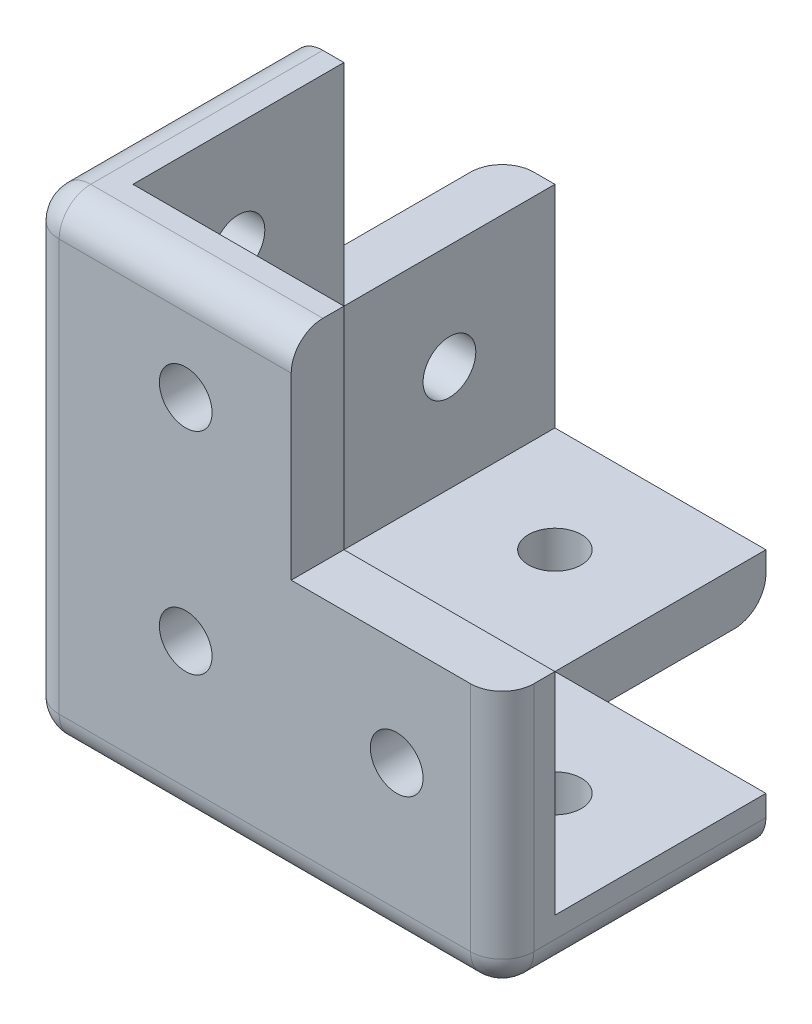
ISO-10303-21;
HEADER;
FILE_DESCRIPTION(('STEP AP214'),'2;1');
FILE_NAME('part.step','',(''),(''),'','','');
FILE_SCHEMA(('AUTOMOTIVE_DESIGN { 1 0 10303 214 1 1 1 1 }'));
ENDSEC;
DATA;
#1=APPLICATION_CONTEXT('core data for automotive mechanical design processes');
#2=APPLICATION_PROTOCOL_DEFINITION('international standard','automotive_design',2000,#1);
#3=PRODUCT_CONTEXT('',#1,'mechanical');
#4=PRODUCT('Part','Part','',(#3));
#5=PRODUCT_RELATED_PRODUCT_CATEGORY('part','',(#4));
#6=PRODUCT_DEFINITION_FORMATION('','',#4);
#7=PRODUCT_DEFINITION_CONTEXT('part definition',#1,'design');
#8=PRODUCT_DEFINITION('design','',#6,#7);
#9=PRODUCT_DEFINITION_SHAPE('','',#8);
#10=(LENGTH_UNIT() NAMED_UNIT(*) SI_UNIT(.MILLI.,.METRE.));
#11=(NAMED_UNIT(*) PLANE_ANGLE_UNIT() SI_UNIT($,.RADIAN.));
#12=(NAMED_UNIT(*) SI_UNIT($,.STERADIAN.) SOLID_ANGLE_UNIT());
#13=UNCERTAINTY_MEASURE_WITH_UNIT(LENGTH_MEASURE(1.E-05),#10,'distance_accuracy_value','');
#14=(GEOMETRIC_REPRESENTATION_CONTEXT(3) GLOBAL_UNCERTAINTY_ASSIGNED_CONTEXT((#13)) GLOBAL_UNIT_ASSIGNED_CONTEXT((#10,
#11,#12)) REPRESENTATION_CONTEXT('',''));
#15=CARTESIAN_POINT('',(0.,0.,0.));
#16=DIRECTION('',(0.,0.,1.));
#17=DIRECTION('',(1.,0.,0.));
#18=AXIS2_PLACEMENT_3D('',#15,#16,#17);
#19=CARTESIAN_POINT('',(20.,20.,0.));
#20=DIRECTION('',(1.,0.,0.));
#21=DIRECTION('',(0.,0.,-1.));
#22=AXIS2_PLACEMENT_3D('',#19,#20,#21);
#23=PLANE('',#22);
#24=DIRECTION('',(0.,0.,1.));
#25=VECTOR('',#24,1.);
#26=CARTESIAN_POINT('',(20.,-5.,0.));
#27=LINE('',#26,#25);
#28=CARTESIAN_POINT('',(20.,-5.,-37.));
#29=VERTEX_POINT('',#28);
#30=CARTESIAN_POINT('',(20.,-5.,-20.));
#31=VERTEX_POINT('',#30);
#32=EDGE_CURVE('E222',#29,#31,#27,.T.);
#33=ORIENTED_EDGE('',*,*,#32,.F.);
#34=CARTESIAN_POINT('',(20.,-2.,-37.));
#35=DIRECTION('',(1.,0.,0.));
#36=DIRECTION('',(0.,0.,-1.));
#37=AXIS2_PLACEMENT_3D('',#34,#35,#36);
#38=CIRCLE('',#37,3.);
#39=CARTESIAN_POINT('',(20.,-2.,-40.));
#40=VERTEX_POINT('',#39);
#41=EDGE_CURVE('E280',#29,#40,#38,.T.);
#42=ORIENTED_EDGE('',*,*,#41,.T.);
#43=DIRECTION('',(0.,-1.,0.));
#44=VECTOR('',#43,1.);
#45=CARTESIAN_POINT('',(20.,20.,-40.));
#46=LINE('',#45,#44);
#47=CARTESIAN_POINT('',(20.,0.,-40.));
#48=VERTEX_POINT('',#47);
#49=EDGE_CURVE('E236',#48,#40,#46,.T.);
#50=ORIENTED_EDGE('',*,*,#49,.F.);
#51=DIRECTION('',(0.,0.,-1.));
#52=VECTOR('',#51,1.);
#53=CARTESIAN_POINT('',(20.,0.,0.));
#54=LINE('',#53,#52);
#55=CARTESIAN_POINT('',(20.,0.,-20.));
#56=VERTEX_POINT('',#55);
#57=EDGE_CURVE('E188',#56,#48,#54,.T.);
#58=ORIENTED_EDGE('',*,*,#57,.F.);
#59=DIRECTION('',(0.,-1.,0.));
#60=VECTOR('',#59,1.);
#61=CARTESIAN_POINT('',(20.,20.,-20.));
#62=LINE('',#61,#60);
#63=EDGE_CURVE('E242',#56,#31,#62,.T.);
#64=ORIENTED_EDGE('',*,*,#63,.T.);
#65=EDGE_LOOP('',(#33,#42,#50,#58,#64));
#66=FACE_BOUND('',#65,.T.);
#67=ADVANCED_FACE('F34',(#66),#23,.T.);
#68=CARTESIAN_POINT('',(0.,20.,-20.));
#69=DIRECTION('',(0.,0.,1.));
#70=DIRECTION('',(1.,0.,0.));
#71=AXIS2_PLACEMENT_3D('',#68,#69,#70);
#72=PLANE('',#71);
#73=DIRECTION('',(0.,-1.,0.));
#74=VECTOR('',#73,1.);
#75=CARTESIAN_POINT('',(40.,20.,-20.));
#76=LINE('',#75,#74);
#77=CARTESIAN_POINT('',(40.,0.,-20.));
#78=VERTEX_POINT('',#77);
#79=CARTESIAN_POINT('',(40.,-2.,-20.));
#80=VERTEX_POINT('',#79);
#81=EDGE_CURVE('E247',#78,#80,#76,.T.);
#82=ORIENTED_EDGE('',*,*,#81,.T.);
#83=CARTESIAN_POINT('',(37.,-2.,-20.));
#84=DIRECTION('',(0.,0.,1.));
#85=DIRECTION('',(1.,0.,0.));
#86=AXIS2_PLACEMENT_3D('',#83,#84,#85);
#87=CIRCLE('',#86,3.);
#88=CARTESIAN_POINT('',(37.,-5.,-20.));
#89=VERTEX_POINT('',#88);
#90=EDGE_CURVE('E286',#80,#89,#87,.F.);
#91=ORIENTED_EDGE('',*,*,#90,.T.);
#92=DIRECTION('',(1.,0.,0.));
#93=VECTOR('',#92,1.);
#94=CARTESIAN_POINT('',(0.,-5.,-20.));
#95=LINE('',#94,#93);
#96=EDGE_CURVE('E224',#31,#89,#95,.T.);
#97=ORIENTED_EDGE('',*,*,#96,.F.);
#98=ORIENTED_EDGE('',*,*,#63,.F.);
#99=DIRECTION('',(-1.,0.,0.));
#100=VECTOR('',#99,1.);
#101=CARTESIAN_POINT('',(0.,0.,-20.));
#102=LINE('',#101,#100);
#103=EDGE_CURVE('E201',#78,#56,#102,.T.);
#104=ORIENTED_EDGE('',*,*,#103,.F.);
#105=EDGE_LOOP('',(#82,#91,#97,#98,#104));
#106=FACE_BOUND('',#105,.T.);
#107=ADVANCED_FACE('F413',(#106),#72,.F.);
#108=DIRECTION('',(0.,0.,1.));
#109=VECTOR('',#108,1.);
#110=CARTESIAN_POINT('',(20.,40.,0.));
#111=LINE('',#110,#109);
#112=CARTESIAN_POINT('',(20.,40.,0.));
#113=VERTEX_POINT('',#112);
#114=CARTESIAN_POINT('',(20.,40.,2.));
#115=VERTEX_POINT('',#114);
#116=EDGE_CURVE('E246',#113,#115,#111,.T.);
#117=ORIENTED_EDGE('',*,*,#116,.T.);
#118=CARTESIAN_POINT('',(20.,37.,2.));
#119=DIRECTION('',(1.,0.,0.));
#120=DIRECTION('',(0.,0.,-1.));
#121=AXIS2_PLACEMENT_3D('',#118,#119,#120);
#122=CIRCLE('',#121,3.);
#123=CARTESIAN_POINT('',(20.,37.,5.));
#124=VERTEX_POINT('',#123);
#125=EDGE_CURVE('E11',#115,#124,#122,.T.);
#126=ORIENTED_EDGE('',*,*,#125,.T.);
#127=DIRECTION('',(0.,1.,0.));
#128=VECTOR('',#127,1.);
#129=CARTESIAN_POINT('',(20.,20.,5.));
#130=LINE('',#129,#128);
#131=CARTESIAN_POINT('',(20.,20.,5.));
#132=VERTEX_POINT('',#131);
#133=EDGE_CURVE('E219',#132,#124,#130,.T.);
#134=ORIENTED_EDGE('',*,*,#133,.F.);
#135=DIRECTION('',(0.,0.,1.));
#136=VECTOR('',#135,1.);
#137=CARTESIAN_POINT('',(20.,20.,0.));
#138=LINE('',#137,#136);
#139=CARTESIAN_POINT('',(20.,20.,0.));
#140=VERTEX_POINT('',#139);
#141=EDGE_CURVE('E227',#140,#132,#138,.T.);
#142=ORIENTED_EDGE('',*,*,#141,.F.);
#143=DIRECTION('',(0.,-1.,0.));
#144=VECTOR('',#143,1.);
#145=CARTESIAN_POINT('',(20.,20.,0.));
#146=LINE('',#145,#144);
#147=EDGE_CURVE('E205',#113,#140,#146,.T.);
#148=ORIENTED_EDGE('',*,*,#147,.F.);
#149=EDGE_LOOP('',(#117,#126,#134,#142,#148));
#150=FACE_BOUND('',#149,.T.);
#151=ADVANCED_FACE('F502',(#150),#23,.T.);
#152=CARTESIAN_POINT('',(0.,20.,-40.));
#153=DIRECTION('',(0.,0.,-1.));
#154=DIRECTION('',(-1.,0.,0.));
#155=AXIS2_PLACEMENT_3D('',#152,#153,#154);
#156=PLANE('',#155);
#157=DIRECTION('',(1.,0.,0.));
#158=VECTOR('',#157,1.);
#159=CARTESIAN_POINT('',(0.,-2.,-40.));
#160=LINE('',#159,#158);
#161=CARTESIAN_POINT('',(-2.,-2.,-40.));
#162=VERTEX_POINT('',#161);
#163=EDGE_CURVE('E258',#40,#162,#160,.F.);
#164=ORIENTED_EDGE('',*,*,#163,.T.);
#165=DIRECTION('',(0.,1.,0.));
#166=VECTOR('',#165,1.);
#167=CARTESIAN_POINT('',(-2.,20.,-40.));
#168=LINE('',#167,#166);
#169=CARTESIAN_POINT('',(-2.,20.,-40.));
#170=VERTEX_POINT('',#169);
#171=EDGE_CURVE('E260',#162,#170,#168,.T.);
#172=ORIENTED_EDGE('',*,*,#171,.T.);
#173=DIRECTION('',(1.,0.,0.));
#174=VECTOR('',#173,1.);
#175=CARTESIAN_POINT('',(0.,20.,-40.));
#176=LINE('',#175,#174);
#177=CARTESIAN_POINT('',(0.,20.,-40.));
#178=VERTEX_POINT('',#177);
#179=EDGE_CURVE('E197',#170,#178,#176,.T.);
#180=ORIENTED_EDGE('',*,*,#179,.T.);
#181=DIRECTION('',(0.,1.,0.));
#182=VECTOR('',#181,1.);
#183=CARTESIAN_POINT('',(0.,0.,-40.));
#184=LINE('',#183,#182);
#185=CARTESIAN_POINT('',(0.,0.,-40.));
#186=VERTEX_POINT('',#185);
#187=EDGE_CURVE('E175',#186,#178,#184,.T.);
#188=ORIENTED_EDGE('',*,*,#187,.F.);
#189=DIRECTION('',(-1.,0.,0.));
#190=VECTOR('',#189,1.);
#191=CARTESIAN_POINT('',(0.,0.,-40.));
#192=LINE('',#191,#190);
#193=EDGE_CURVE('E183',#48,#186,#192,.T.);
#194=ORIENTED_EDGE('',*,*,#193,.F.);
#195=ORIENTED_EDGE('',*,*,#49,.T.);
#196=EDGE_LOOP('',(#164,#172,#180,#188,#194,#195));
#197=FACE_BOUND('',#196,.T.);
#198=ADVANCED_FACE('F194',(#197),#156,.T.);
#199=CARTESIAN_POINT('',(0.,20.,0.));
#200=DIRECTION('',(0.,1.,0.));
#201=DIRECTION('',(0.,0.,1.));
#202=AXIS2_PLACEMENT_3D('',#199,#200,#201);
#203=PLANE('',#202);
#204=ORIENTED_EDGE('',*,*,#179,.F.);
#205=CARTESIAN_POINT('',(-2.,20.,-37.));
#206=DIRECTION('',(0.,1.,0.));
#207=DIRECTION('',(0.,0.,1.));
#208=AXIS2_PLACEMENT_3D('',#205,#206,#207);
#209=CIRCLE('',#208,3.);
#210=CARTESIAN_POINT('',(-5.,20.,-37.));
#211=VERTEX_POINT('',#210);
#212=EDGE_CURVE('E262',#170,#211,#209,.T.);
#213=ORIENTED_EDGE('',*,*,#212,.T.);
#214=DIRECTION('',(0.,0.,-1.));
#215=VECTOR('',#214,1.);
#216=CARTESIAN_POINT('',(-5.,20.,0.));
#217=LINE('',#216,#215);
#218=CARTESIAN_POINT('',(-5.,20.,-20.));
#219=VERTEX_POINT('',#218);
#220=EDGE_CURVE('E212',#219,#211,#217,.T.);
#221=ORIENTED_EDGE('',*,*,#220,.F.);
#222=DIRECTION('',(-1.,0.,0.));
#223=VECTOR('',#222,1.);
#224=CARTESIAN_POINT('',(0.,20.,-20.));
#225=LINE('',#224,#223);
#226=CARTESIAN_POINT('',(0.,20.,-20.));
#227=VERTEX_POINT('',#226);
#228=EDGE_CURVE('E254',#227,#219,#225,.T.);
#229=ORIENTED_EDGE('',*,*,#228,.F.);
#230=DIRECTION('',(0.,0.,1.));
#231=VECTOR('',#230,1.);
#232=CARTESIAN_POINT('',(0.,20.,0.));
#233=LINE('',#232,#231);
#234=EDGE_CURVE('E210',#178,#227,#233,.T.);
#235=ORIENTED_EDGE('',*,*,#234,.F.);
#236=EDGE_LOOP('',(#204,#213,#221,#229,#235));
#237=FACE_BOUND('',#236,.T.);
#238=ADVANCED_FACE('F450',(#237),#203,.T.);
#239=CARTESIAN_POINT('',(0.,40.,-20.));
#240=DIRECTION('',(0.,0.,1.));
#241=DIRECTION('',(1.,0.,0.));
#242=AXIS2_PLACEMENT_3D('',#239,#240,#241);
#243=PLANE('',#242);
#244=DIRECTION('',(0.,-1.,0.));
#245=VECTOR('',#244,1.);
#246=CARTESIAN_POINT('',(-5.,0.,-20.));
#247=LINE('',#246,#245);
#248=CARTESIAN_POINT('',(-5.,37.,-20.));
#249=VERTEX_POINT('',#248);
#250=EDGE_CURVE('E215',#249,#219,#247,.T.);
#251=ORIENTED_EDGE('',*,*,#250,.F.);
#252=CARTESIAN_POINT('',(-2.,37.,-20.));
#253=DIRECTION('',(0.,0.,1.));
#254=DIRECTION('',(1.,0.,0.));
#255=AXIS2_PLACEMENT_3D('',#252,#253,#254);
#256=CIRCLE('',#255,3.);
#257=CARTESIAN_POINT('',(-2.,40.,-20.));
#258=VERTEX_POINT('',#257);
#259=EDGE_CURVE('E298',#249,#258,#256,.F.);
#260=ORIENTED_EDGE('',*,*,#259,.T.);
#261=DIRECTION('',(-1.,0.,0.));
#262=VECTOR('',#261,1.);
#263=CARTESIAN_POINT('',(0.,40.,-20.));
#264=LINE('',#263,#262);
#265=CARTESIAN_POINT('',(0.,40.,-20.));
#266=VERTEX_POINT('',#265);
#267=EDGE_CURVE('E252',#266,#258,#264,.T.);
#268=ORIENTED_EDGE('',*,*,#267,.F.);
#269=DIRECTION('',(0.,-1.,0.));
#270=VECTOR('',#269,1.);
#271=CARTESIAN_POINT('',(0.,40.,-20.));
#272=LINE('',#271,#270);
#273=EDGE_CURVE('E207',#266,#227,#272,.T.);
#274=ORIENTED_EDGE('',*,*,#273,.T.);
#275=ORIENTED_EDGE('',*,*,#228,.T.);
#276=EDGE_LOOP('',(#251,#260,#268,#274,#275));
#277=FACE_BOUND('',#276,.T.);
#278=ADVANCED_FACE('F457',(#277),#243,.F.);
#279=CARTESIAN_POINT('',(0.,40.,0.));
#280=DIRECTION('',(0.,1.,0.));
#281=DIRECTION('',(0.,0.,1.));
#282=AXIS2_PLACEMENT_3D('',#279,#280,#281);
#283=PLANE('',#282);
#284=ORIENTED_EDGE('',*,*,#267,.T.);
#285=DIRECTION('',(0.,0.,-1.));
#286=VECTOR('',#285,1.);
#287=CARTESIAN_POINT('',(-2.,40.,5.));
#288=LINE('',#287,#286);
#289=CARTESIAN_POINT('',(-2.,40.,2.));
#290=VERTEX_POINT('',#289);
#291=EDGE_CURVE('E43',#258,#290,#288,.F.);
#292=ORIENTED_EDGE('',*,*,#291,.T.);
#293=DIRECTION('',(-1.,0.,0.));
#294=VECTOR('',#293,1.);
#295=CARTESIAN_POINT('',(20.,40.,2.));
#296=LINE('',#295,#294);
#297=EDGE_CURVE('E54',#290,#115,#296,.F.);
#298=ORIENTED_EDGE('',*,*,#297,.T.);
#299=ORIENTED_EDGE('',*,*,#116,.F.);
#300=DIRECTION('',(1.,0.,0.));
#301=VECTOR('',#300,1.);
#302=CARTESIAN_POINT('',(0.,40.,0.));
#303=LINE('',#302,#301);
#304=CARTESIAN_POINT('',(0.,40.,0.));
#305=VERTEX_POINT('',#304);
#306=EDGE_CURVE('E192',#305,#113,#303,.T.);
#307=ORIENTED_EDGE('',*,*,#306,.F.);
#308=DIRECTION('',(0.,0.,1.));
#309=VECTOR('',#308,1.);
#310=CARTESIAN_POINT('',(0.,40.,0.));
#311=LINE('',#310,#309);
#312=EDGE_CURVE('E241',#266,#305,#311,.T.);
#313=ORIENTED_EDGE('',*,*,#312,.F.);
#314=EDGE_LOOP('',(#284,#292,#298,#299,#307,#313));
#315=FACE_BOUND('',#314,.T.);
#316=ADVANCED_FACE('F459',(#315),#283,.T.);
#317=CARTESIAN_POINT('',(40.,20.,0.));
#318=DIRECTION('',(-1.,0.,0.));
#319=DIRECTION('',(0.,0.,1.));
#320=AXIS2_PLACEMENT_3D('',#317,#318,#319);
#321=PLANE('',#320);
#322=DIRECTION('',(0.,1.,0.));
#323=VECTOR('',#322,1.);
#324=CARTESIAN_POINT('',(40.,20.,2.));
#325=LINE('',#324,#323);
#326=CARTESIAN_POINT('',(40.,20.,2.));
#327=VERTEX_POINT('',#326);
#328=CARTESIAN_POINT('',(40.,-2.,2.));
#329=VERTEX_POINT('',#328);
#330=EDGE_CURVE('E282',#327,#329,#325,.F.);
#331=ORIENTED_EDGE('',*,*,#330,.T.);
#332=DIRECTION('',(0.,0.,1.));
#333=VECTOR('',#332,1.);
#334=CARTESIAN_POINT('',(40.,-2.,-20.));
#335=LINE('',#334,#333);
#336=EDGE_CURVE('E284',#329,#80,#335,.F.);
#337=ORIENTED_EDGE('',*,*,#336,.T.);
#338=ORIENTED_EDGE('',*,*,#81,.F.);
#339=DIRECTION('',(0.,0.,-1.));
#340=VECTOR('',#339,1.);
#341=CARTESIAN_POINT('',(40.,0.,0.));
#342=LINE('',#341,#340);
#343=CARTESIAN_POINT('',(40.,0.,0.));
#344=VERTEX_POINT('',#343);
#345=EDGE_CURVE('E396',#344,#78,#342,.T.);
#346=ORIENTED_EDGE('',*,*,#345,.F.);
#347=DIRECTION('',(0.,1.,0.));
#348=VECTOR('',#347,1.);
#349=CARTESIAN_POINT('',(40.,0.,0.));
#350=LINE('',#349,#348);
#351=CARTESIAN_POINT('',(40.,20.,0.));
#352=VERTEX_POINT('',#351);
#353=EDGE_CURVE('E199',#344,#352,#350,.T.);
#354=ORIENTED_EDGE('',*,*,#353,.T.);
#355=DIRECTION('',(0.,0.,-1.));
#356=VECTOR('',#355,1.);
#357=CARTESIAN_POINT('',(40.,20.,0.));
#358=LINE('',#357,#356);
#359=EDGE_CURVE('E230',#327,#352,#358,.T.);
#360=ORIENTED_EDGE('',*,*,#359,.F.);
#361=EDGE_LOOP('',(#331,#337,#338,#346,#354,#360));
#362=FACE_BOUND('',#361,.T.);
#363=ADVANCED_FACE('F403',(#362),#321,.F.);
#364=CARTESIAN_POINT('',(0.,20.,0.));
#365=DIRECTION('',(0.,1.,0.));
#366=DIRECTION('',(0.,0.,1.));
#367=AXIS2_PLACEMENT_3D('',#364,#365,#366);
#368=PLANE('',#367);
#369=DIRECTION('',(-1.,0.,0.));
#370=VECTOR('',#369,1.);
#371=CARTESIAN_POINT('',(40.,20.,5.));
#372=LINE('',#371,#370);
#373=CARTESIAN_POINT('',(37.,20.,5.));
#374=VERTEX_POINT('',#373);
#375=EDGE_CURVE('E217',#374,#132,#372,.T.);
#376=ORIENTED_EDGE('',*,*,#375,.F.);
#377=CARTESIAN_POINT('',(37.,20.,2.));
#378=DIRECTION('',(0.,1.,0.));
#379=DIRECTION('',(0.,0.,1.));
#380=AXIS2_PLACEMENT_3D('',#377,#378,#379);
#381=CIRCLE('',#380,3.);
#382=EDGE_CURVE('E296',#374,#327,#381,.T.);
#383=ORIENTED_EDGE('',*,*,#382,.T.);
#384=ORIENTED_EDGE('',*,*,#359,.T.);
#385=DIRECTION('',(1.,0.,0.));
#386=VECTOR('',#385,1.);
#387=CARTESIAN_POINT('',(0.,20.,0.));
#388=LINE('',#387,#386);
#389=EDGE_CURVE('E238',#140,#352,#388,.T.);
#390=ORIENTED_EDGE('',*,*,#389,.F.);
#391=ORIENTED_EDGE('',*,*,#141,.T.);
#392=EDGE_LOOP('',(#376,#383,#384,#390,#391));
#393=FACE_BOUND('',#392,.T.);
#394=ADVANCED_FACE('F419',(#393),#368,.T.);
#395=CARTESIAN_POINT('',(-5.,-5.,0.));
#396=DIRECTION('',(1.,0.,0.));
#397=DIRECTION('',(0.,0.,-1.));
#398=AXIS2_PLACEMENT_3D('',#395,#396,#397);
#399=PLANE('',#398);
#400=CARTESIAN_POINT('',(-5.,10.,-10.));
#401=DIRECTION('',(1.,0.,0.));
#402=DIRECTION('',(0.,0.,-1.));
#403=AXIS2_PLACEMENT_3D('',#400,#401,#402);
#404=CIRCLE('',#403,2.5);
#405=CARTESIAN_POINT('',(-5.,10.,-12.5));
#406=VERTEX_POINT('',#405);
#407=EDGE_CURVE('E340',#406,#406,#404,.T.);
#408=ORIENTED_EDGE('',*,*,#407,.T.);
#409=EDGE_LOOP('',(#408));
#410=FACE_BOUND('',#409,.T.);
#411=CARTESIAN_POINT('',(-5.,10.,-30.));
#412=DIRECTION('',(1.,0.,0.));
#413=DIRECTION('',(0.,0.,-1.));
#414=AXIS2_PLACEMENT_3D('',#411,#412,#413);
#415=CIRCLE('',#414,2.5);
#416=CARTESIAN_POINT('',(-5.,10.,-32.5));
#417=VERTEX_POINT('',#416);
#418=EDGE_CURVE('E348',#417,#417,#415,.T.);
#419=ORIENTED_EDGE('',*,*,#418,.T.);
#420=EDGE_LOOP('',(#419));
#421=FACE_BOUND('',#420,.T.);
#422=CARTESIAN_POINT('',(-5.,30.,-10.));
#423=DIRECTION('',(1.,0.,0.));
#424=DIRECTION('',(0.,0.,-1.));
#425=AXIS2_PLACEMENT_3D('',#422,#423,#424);
#426=CIRCLE('',#425,2.5);
#427=CARTESIAN_POINT('',(-5.,30.,-12.5));
#428=VERTEX_POINT('',#427);
#429=EDGE_CURVE('E354',#428,#428,#426,.T.);
#430=ORIENTED_EDGE('',*,*,#429,.T.);
#431=EDGE_LOOP('',(#430));
#432=FACE_BOUND('',#431,.T.);
#433=ORIENTED_EDGE('',*,*,#220,.T.);
#434=DIRECTION('',(0.,1.,0.));
#435=VECTOR('',#434,1.);
#436=CARTESIAN_POINT('',(-5.,-5.,-37.));
#437=LINE('',#436,#435);
#438=CARTESIAN_POINT('',(-5.,-2.,-37.));
#439=VERTEX_POINT('',#438);
#440=EDGE_CURVE('E270',#211,#439,#437,.F.);
#441=ORIENTED_EDGE('',*,*,#440,.T.);
#442=DIRECTION('',(0.,0.,-1.));
#443=VECTOR('',#442,1.);
#444=CARTESIAN_POINT('',(-5.,-2.,5.));
#445=LINE('',#444,#443);
#446=CARTESIAN_POINT('',(-5.,-2.,2.));
#447=VERTEX_POINT('',#446);
#448=EDGE_CURVE('E268',#439,#447,#445,.F.);
#449=ORIENTED_EDGE('',*,*,#448,.T.);
#450=DIRECTION('',(0.,1.,0.));
#451=VECTOR('',#450,1.);
#452=CARTESIAN_POINT('',(-5.,-5.,2.));
#453=LINE('',#452,#451);
#454=CARTESIAN_POINT('',(-5.,37.,2.));
#455=VERTEX_POINT('',#454);
#456=EDGE_CURVE('E266',#447,#455,#453,.T.);
#457=ORIENTED_EDGE('',*,*,#456,.T.);
#458=DIRECTION('',(0.,0.,-1.));
#459=VECTOR('',#458,1.);
#460=CARTESIAN_POINT('',(-5.,37.,-20.));
#461=LINE('',#460,#459);
#462=EDGE_CURVE('E264',#455,#249,#461,.T.);
#463=ORIENTED_EDGE('',*,*,#462,.T.);
#464=ORIENTED_EDGE('',*,*,#250,.T.);
#465=EDGE_LOOP('',(#433,#441,#449,#457,#463,#464));
#466=FACE_BOUND('',#465,.T.);
#467=ADVANCED_FACE('F464',(#410,#421,#432,#466),#399,.F.);
#468=CARTESIAN_POINT('',(0.,-5.,5.));
#469=DIRECTION('',(0.,0.,-1.));
#470=DIRECTION('',(-1.,0.,0.));
#471=AXIS2_PLACEMENT_3D('',#468,#469,#470);
#472=PLANE('',#471);
#473=CARTESIAN_POINT('',(10.,10.,5.));
#474=DIRECTION('',(0.,0.,-1.));
#475=DIRECTION('',(-1.,0.,0.));
#476=AXIS2_PLACEMENT_3D('',#473,#474,#475);
#477=CIRCLE('',#476,2.5);
#478=CARTESIAN_POINT('',(7.5,10.,5.));
#479=VERTEX_POINT('',#478);
#480=EDGE_CURVE('E360',#479,#479,#477,.T.);
#481=ORIENTED_EDGE('',*,*,#480,.T.);
#482=EDGE_LOOP('',(#481));
#483=FACE_BOUND('',#482,.T.);
#484=CARTESIAN_POINT('',(30.,10.,5.));
#485=DIRECTION('',(0.,0.,-1.));
#486=DIRECTION('',(-1.,0.,0.));
#487=AXIS2_PLACEMENT_3D('',#484,#485,#486);
#488=CIRCLE('',#487,2.5);
#489=CARTESIAN_POINT('',(27.5,10.,5.));
#490=VERTEX_POINT('',#489);
#491=EDGE_CURVE('E366',#490,#490,#488,.T.);
#492=ORIENTED_EDGE('',*,*,#491,.T.);
#493=EDGE_LOOP('',(#492));
#494=FACE_BOUND('',#493,.T.);
#495=CARTESIAN_POINT('',(10.,30.,5.));
#496=DIRECTION('',(0.,0.,-1.));
#497=DIRECTION('',(-1.,0.,0.));
#498=AXIS2_PLACEMENT_3D('',#495,#496,#497);
#499=CIRCLE('',#498,2.5);
#500=CARTESIAN_POINT('',(7.5,30.,5.));
#501=VERTEX_POINT('',#500);
#502=EDGE_CURVE('E372',#501,#501,#499,.T.);
#503=ORIENTED_EDGE('',*,*,#502,.T.);
#504=EDGE_LOOP('',(#503));
#505=FACE_BOUND('',#504,.T.);
#506=DIRECTION('',(-1.,0.,0.));
#507=VECTOR('',#506,1.);
#508=CARTESIAN_POINT('',(40.,-2.,5.));
#509=LINE('',#508,#507);
#510=CARTESIAN_POINT('',(-2.,-2.,5.));
#511=VERTEX_POINT('',#510);
#512=CARTESIAN_POINT('',(37.,-2.,5.));
#513=VERTEX_POINT('',#512);
#514=EDGE_CURVE('E292',#511,#513,#509,.F.);
#515=ORIENTED_EDGE('',*,*,#514,.T.);
#516=DIRECTION('',(0.,1.,0.));
#517=VECTOR('',#516,1.);
#518=CARTESIAN_POINT('',(37.,-5.,5.));
#519=LINE('',#518,#517);
#520=EDGE_CURVE('E294',#513,#374,#519,.T.);
#521=ORIENTED_EDGE('',*,*,#520,.T.);
#522=ORIENTED_EDGE('',*,*,#375,.T.);
#523=ORIENTED_EDGE('',*,*,#133,.T.);
#524=DIRECTION('',(-1.,0.,0.));
#525=VECTOR('',#524,1.);
#526=CARTESIAN_POINT('',(-5.,37.,5.));
#527=LINE('',#526,#525);
#528=CARTESIAN_POINT('',(-2.,37.,5.));
#529=VERTEX_POINT('',#528);
#530=EDGE_CURVE('E288',#124,#529,#527,.T.);
#531=ORIENTED_EDGE('',*,*,#530,.T.);
#532=DIRECTION('',(0.,1.,0.));
#533=VECTOR('',#532,1.);
#534=CARTESIAN_POINT('',(-2.,-5.,5.));
#535=LINE('',#534,#533);
#536=EDGE_CURVE('E290',#529,#511,#535,.F.);
#537=ORIENTED_EDGE('',*,*,#536,.T.);
#538=EDGE_LOOP('',(#515,#521,#522,#523,#531,#537));
#539=FACE_BOUND('',#538,.T.);
#540=ADVANCED_FACE('F483',(#483,#494,#505,#539),#472,.F.);
#541=CARTESIAN_POINT('',(0.,-5.,0.));
#542=DIRECTION('',(0.,-1.,0.));
#543=DIRECTION('',(0.,0.,-1.));
#544=AXIS2_PLACEMENT_3D('',#541,#542,#543);
#545=PLANE('',#544);
#546=CARTESIAN_POINT('',(10.,-5.,-10.));
#547=DIRECTION('',(0.,1.,0.));
#548=DIRECTION('',(0.,0.,1.));
#549=AXIS2_PLACEMENT_3D('',#546,#547,#548);
#550=CIRCLE('',#549,2.5);
#551=CARTESIAN_POINT('',(10.,-5.,-7.5));
#552=VERTEX_POINT('',#551);
#553=EDGE_CURVE('E378',#552,#552,#550,.T.);
#554=ORIENTED_EDGE('',*,*,#553,.T.);
#555=EDGE_LOOP('',(#554));
#556=FACE_BOUND('',#555,.T.);
#557=CARTESIAN_POINT('',(30.,-5.,-10.));
#558=DIRECTION('',(0.,1.,0.));
#559=DIRECTION('',(0.,0.,1.));
#560=AXIS2_PLACEMENT_3D('',#557,#558,#559);
#561=CIRCLE('',#560,2.5);
#562=CARTESIAN_POINT('',(30.,-5.,-7.5));
#563=VERTEX_POINT('',#562);
#564=EDGE_CURVE('E384',#563,#563,#561,.T.);
#565=ORIENTED_EDGE('',*,*,#564,.T.);
#566=EDGE_LOOP('',(#565));
#567=FACE_BOUND('',#566,.T.);
#568=CARTESIAN_POINT('',(10.,-5.,-30.));
#569=DIRECTION('',(0.,1.,0.));
#570=DIRECTION('',(0.,0.,1.));
#571=AXIS2_PLACEMENT_3D('',#568,#569,#570);
#572=CIRCLE('',#571,2.5);
#573=CARTESIAN_POINT('',(10.,-5.,-27.5));
#574=VERTEX_POINT('',#573);
#575=EDGE_CURVE('E390',#574,#574,#572,.T.);
#576=ORIENTED_EDGE('',*,*,#575,.T.);
#577=EDGE_LOOP('',(#576));
#578=FACE_BOUND('',#577,.T.);
#579=DIRECTION('',(0.,0.,-1.));
#580=VECTOR('',#579,1.);
#581=CARTESIAN_POINT('',(-2.,-5.,-40.));
#582=LINE('',#581,#580);
#583=CARTESIAN_POINT('',(-2.,-5.,2.));
#584=VERTEX_POINT('',#583);
#585=CARTESIAN_POINT('',(-2.,-5.,-37.));
#586=VERTEX_POINT('',#585);
#587=EDGE_CURVE('E272',#584,#586,#582,.T.);
#588=ORIENTED_EDGE('',*,*,#587,.T.);
#589=DIRECTION('',(1.,0.,0.));
#590=VECTOR('',#589,1.);
#591=CARTESIAN_POINT('',(0.,-5.,-37.));
#592=LINE('',#591,#590);
#593=EDGE_CURVE('E278',#586,#29,#592,.T.);
#594=ORIENTED_EDGE('',*,*,#593,.T.);
#595=ORIENTED_EDGE('',*,*,#32,.T.);
#596=ORIENTED_EDGE('',*,*,#96,.T.);
#597=DIRECTION('',(0.,0.,1.));
#598=VECTOR('',#597,1.);
#599=CARTESIAN_POINT('',(37.,-5.,5.));
#600=LINE('',#599,#598);
#601=CARTESIAN_POINT('',(37.,-5.,2.));
#602=VERTEX_POINT('',#601);
#603=EDGE_CURVE('E276',#89,#602,#600,.T.);
#604=ORIENTED_EDGE('',*,*,#603,.T.);
#605=DIRECTION('',(-1.,0.,0.));
#606=VECTOR('',#605,1.);
#607=CARTESIAN_POINT('',(-5.,-5.,2.));
#608=LINE('',#607,#606);
#609=EDGE_CURVE('E274',#602,#584,#608,.T.);
#610=ORIENTED_EDGE('',*,*,#609,.T.);
#611=EDGE_LOOP('',(#588,#594,#595,#596,#604,#610));
#612=FACE_BOUND('',#611,.T.);
#613=ADVANCED_FACE('F432',(#556,#567,#578,#612),#545,.T.);
#614=CARTESIAN_POINT('',(0.,0.,0.));
#615=DIRECTION('',(0.,0.,1.));
#616=DIRECTION('',(1.,0.,0.));
#617=AXIS2_PLACEMENT_3D('',#614,#615,#616);
#618=PLANE('',#617);
#619=CARTESIAN_POINT('',(10.,10.,0.));
#620=DIRECTION('',(0.,0.,-1.));
#621=DIRECTION('',(-1.,0.,0.));
#622=AXIS2_PLACEMENT_3D('',#619,#620,#621);
#623=CIRCLE('',#622,2.5);
#624=CARTESIAN_POINT('',(7.5,10.,0.));
#625=VERTEX_POINT('',#624);
#626=EDGE_CURVE('E357',#625,#625,#623,.T.);
#627=ORIENTED_EDGE('',*,*,#626,.F.);
#628=EDGE_LOOP('',(#627));
#629=FACE_BOUND('',#628,.T.);
#630=CARTESIAN_POINT('',(30.,10.,0.));
#631=DIRECTION('',(0.,0.,-1.));
#632=DIRECTION('',(-1.,0.,0.));
#633=AXIS2_PLACEMENT_3D('',#630,#631,#632);
#634=CIRCLE('',#633,2.5);
#635=CARTESIAN_POINT('',(27.5,10.,0.));
#636=VERTEX_POINT('',#635);
#637=EDGE_CURVE('E363',#636,#636,#634,.T.);
#638=ORIENTED_EDGE('',*,*,#637,.F.);
#639=EDGE_LOOP('',(#638));
#640=FACE_BOUND('',#639,.T.);
#641=CARTESIAN_POINT('',(10.,30.,0.));
#642=DIRECTION('',(0.,0.,-1.));
#643=DIRECTION('',(-1.,0.,0.));
#644=AXIS2_PLACEMENT_3D('',#641,#642,#643);
#645=CIRCLE('',#644,2.5);
#646=CARTESIAN_POINT('',(7.5,30.,0.));
#647=VERTEX_POINT('',#646);
#648=EDGE_CURVE('E369',#647,#647,#645,.T.);
#649=ORIENTED_EDGE('',*,*,#648,.F.);
#650=EDGE_LOOP('',(#649));
#651=FACE_BOUND('',#650,.T.);
#652=ORIENTED_EDGE('',*,*,#147,.T.);
#653=ORIENTED_EDGE('',*,*,#389,.T.);
#654=ORIENTED_EDGE('',*,*,#353,.F.);
#655=DIRECTION('',(1.,0.,0.));
#656=VECTOR('',#655,1.);
#657=CARTESIAN_POINT('',(0.,0.,0.));
#658=LINE('',#657,#656);
#659=CARTESIAN_POINT('',(0.,0.,0.));
#660=VERTEX_POINT('',#659);
#661=EDGE_CURVE('E182',#660,#344,#658,.T.);
#662=ORIENTED_EDGE('',*,*,#661,.F.);
#663=DIRECTION('',(0.,1.,0.));
#664=VECTOR('',#663,1.);
#665=CARTESIAN_POINT('',(0.,0.,0.));
#666=LINE('',#665,#664);
#667=EDGE_CURVE('E178',#660,#305,#666,.T.);
#668=ORIENTED_EDGE('',*,*,#667,.T.);
#669=ORIENTED_EDGE('',*,*,#306,.T.);
#670=EDGE_LOOP('',(#652,#653,#654,#662,#668,#669));
#671=FACE_BOUND('',#670,.T.);
#672=ADVANCED_FACE('F407',(#629,#640,#651,#671),#618,.F.);
#673=CARTESIAN_POINT('',(0.,0.,0.));
#674=DIRECTION('',(-1.,0.,0.));
#675=DIRECTION('',(0.,0.,1.));
#676=AXIS2_PLACEMENT_3D('',#673,#674,#675);
#677=PLANE('',#676);
#678=CARTESIAN_POINT('',(0.,10.,-10.));
#679=DIRECTION('',(1.,0.,0.));
#680=DIRECTION('',(0.,0.,-1.));
#681=AXIS2_PLACEMENT_3D('',#678,#679,#680);
#682=CIRCLE('',#681,2.5);
#683=CARTESIAN_POINT('',(0.,10.,-12.5));
#684=VERTEX_POINT('',#683);
#685=EDGE_CURVE('E337',#684,#684,#682,.T.);
#686=ORIENTED_EDGE('',*,*,#685,.F.);
#687=EDGE_LOOP('',(#686));
#688=FACE_BOUND('',#687,.T.);
#689=CARTESIAN_POINT('',(0.,10.,-30.));
#690=DIRECTION('',(1.,0.,0.));
#691=DIRECTION('',(0.,0.,-1.));
#692=AXIS2_PLACEMENT_3D('',#689,#690,#691);
#693=CIRCLE('',#692,2.5);
#694=CARTESIAN_POINT('',(0.,10.,-32.5));
#695=VERTEX_POINT('',#694);
#696=EDGE_CURVE('E345',#695,#695,#693,.T.);
#697=ORIENTED_EDGE('',*,*,#696,.F.);
#698=EDGE_LOOP('',(#697));
#699=FACE_BOUND('',#698,.T.);
#700=CARTESIAN_POINT('',(0.,30.,-10.));
#701=DIRECTION('',(1.,0.,0.));
#702=DIRECTION('',(0.,0.,-1.));
#703=AXIS2_PLACEMENT_3D('',#700,#701,#702);
#704=CIRCLE('',#703,2.5);
#705=CARTESIAN_POINT('',(0.,30.,-12.5));
#706=VERTEX_POINT('',#705);
#707=EDGE_CURVE('E351',#706,#706,#704,.T.);
#708=ORIENTED_EDGE('',*,*,#707,.F.);
#709=EDGE_LOOP('',(#708));
#710=FACE_BOUND('',#709,.T.);
#711=ORIENTED_EDGE('',*,*,#234,.T.);
#712=ORIENTED_EDGE('',*,*,#273,.F.);
#713=ORIENTED_EDGE('',*,*,#312,.T.);
#714=ORIENTED_EDGE('',*,*,#667,.F.);
#715=DIRECTION('',(0.,0.,1.));
#716=VECTOR('',#715,1.);
#717=CARTESIAN_POINT('',(0.,0.,0.));
#718=LINE('',#717,#716);
#719=EDGE_CURVE('E171',#186,#660,#718,.T.);
#720=ORIENTED_EDGE('',*,*,#719,.F.);
#721=ORIENTED_EDGE('',*,*,#187,.T.);
#722=EDGE_LOOP('',(#711,#712,#713,#714,#720,#721));
#723=FACE_BOUND('',#722,.T.);
#724=ADVANCED_FACE('F173',(#688,#699,#710,#723),#677,.F.);
#725=CARTESIAN_POINT('',(0.,0.,0.));
#726=DIRECTION('',(0.,1.,0.));
#727=DIRECTION('',(0.,0.,1.));
#728=AXIS2_PLACEMENT_3D('',#725,#726,#727);
#729=PLANE('',#728);
#730=CARTESIAN_POINT('',(10.,0.,-10.));
#731=DIRECTION('',(0.,1.,0.));
#732=DIRECTION('',(0.,0.,1.));
#733=AXIS2_PLACEMENT_3D('',#730,#731,#732);
#734=CIRCLE('',#733,2.5);
#735=CARTESIAN_POINT('',(10.,0.,-7.5));
#736=VERTEX_POINT('',#735);
#737=EDGE_CURVE('E375',#736,#736,#734,.T.);
#738=ORIENTED_EDGE('',*,*,#737,.F.);
#739=EDGE_LOOP('',(#738));
#740=FACE_BOUND('',#739,.T.);
#741=CARTESIAN_POINT('',(30.,0.,-10.));
#742=DIRECTION('',(0.,1.,0.));
#743=DIRECTION('',(0.,0.,1.));
#744=AXIS2_PLACEMENT_3D('',#741,#742,#743);
#745=CIRCLE('',#744,2.5);
#746=CARTESIAN_POINT('',(30.,0.,-7.5));
#747=VERTEX_POINT('',#746);
#748=EDGE_CURVE('E381',#747,#747,#745,.T.);
#749=ORIENTED_EDGE('',*,*,#748,.F.);
#750=EDGE_LOOP('',(#749));
#751=FACE_BOUND('',#750,.T.);
#752=CARTESIAN_POINT('',(10.,0.,-30.));
#753=DIRECTION('',(0.,1.,0.));
#754=DIRECTION('',(0.,0.,1.));
#755=AXIS2_PLACEMENT_3D('',#752,#753,#754);
#756=CIRCLE('',#755,2.5);
#757=CARTESIAN_POINT('',(10.,0.,-27.5));
#758=VERTEX_POINT('',#757);
#759=EDGE_CURVE('E387',#758,#758,#756,.T.);
#760=ORIENTED_EDGE('',*,*,#759,.F.);
#761=EDGE_LOOP('',(#760));
#762=FACE_BOUND('',#761,.T.);
#763=ORIENTED_EDGE('',*,*,#193,.T.);
#764=ORIENTED_EDGE('',*,*,#719,.T.);
#765=ORIENTED_EDGE('',*,*,#661,.T.);
#766=ORIENTED_EDGE('',*,*,#345,.T.);
#767=ORIENTED_EDGE('',*,*,#103,.T.);
#768=ORIENTED_EDGE('',*,*,#57,.T.);
#769=EDGE_LOOP('',(#763,#764,#765,#766,#767,#768));
#770=FACE_BOUND('',#769,.T.);
#771=ADVANCED_FACE('F186',(#740,#751,#762,#770),#729,.T.);
#772=CARTESIAN_POINT('',(10.,-5.,-30.));
#773=DIRECTION('',(0.,1.,0.));
#774=DIRECTION('',(0.,0.,1.));
#775=AXIS2_PLACEMENT_3D('',#772,#773,#774);
#776=CYLINDRICAL_SURFACE('',#775,2.5);
#777=ORIENTED_EDGE('',*,*,#575,.F.);
#778=EDGE_LOOP('',(#777));
#779=FACE_BOUND('',#778,.T.);
#780=ORIENTED_EDGE('',*,*,#759,.T.);
#781=EDGE_LOOP('',(#780));
#782=FACE_BOUND('',#781,.T.);
#783=ADVANCED_FACE('F545',(#779,#782),#776,.F.);
#784=CARTESIAN_POINT('',(30.,-5.,-10.));
#785=DIRECTION('',(0.,1.,0.));
#786=DIRECTION('',(0.,0.,1.));
#787=AXIS2_PLACEMENT_3D('',#784,#785,#786);
#788=CYLINDRICAL_SURFACE('',#787,2.5);
#789=ORIENTED_EDGE('',*,*,#564,.F.);
#790=EDGE_LOOP('',(#789));
#791=FACE_BOUND('',#790,.T.);
#792=ORIENTED_EDGE('',*,*,#748,.T.);
#793=EDGE_LOOP('',(#792));
#794=FACE_BOUND('',#793,.T.);
#795=ADVANCED_FACE('F549',(#791,#794),#788,.F.);
#796=CARTESIAN_POINT('',(10.,-5.,-10.));
#797=DIRECTION('',(0.,1.,0.));
#798=DIRECTION('',(0.,0.,1.));
#799=AXIS2_PLACEMENT_3D('',#796,#797,#798);
#800=CYLINDRICAL_SURFACE('',#799,2.5);
#801=ORIENTED_EDGE('',*,*,#553,.F.);
#802=EDGE_LOOP('',(#801));
#803=FACE_BOUND('',#802,.T.);
#804=ORIENTED_EDGE('',*,*,#737,.T.);
#805=EDGE_LOOP('',(#804));
#806=FACE_BOUND('',#805,.T.);
#807=ADVANCED_FACE('F553',(#803,#806),#800,.F.);
#808=CARTESIAN_POINT('',(10.,30.,5.));
#809=DIRECTION('',(0.,0.,-1.));
#810=DIRECTION('',(-1.,0.,0.));
#811=AXIS2_PLACEMENT_3D('',#808,#809,#810);
#812=CYLINDRICAL_SURFACE('',#811,2.5);
#813=ORIENTED_EDGE('',*,*,#502,.F.);
#814=EDGE_LOOP('',(#813));
#815=FACE_BOUND('',#814,.T.);
#816=ORIENTED_EDGE('',*,*,#648,.T.);
#817=EDGE_LOOP('',(#816));
#818=FACE_BOUND('',#817,.T.);
#819=ADVANCED_FACE('F557',(#815,#818),#812,.F.);
#820=CARTESIAN_POINT('',(30.,10.,5.));
#821=DIRECTION('',(0.,0.,-1.));
#822=DIRECTION('',(-1.,0.,0.));
#823=AXIS2_PLACEMENT_3D('',#820,#821,#822);
#824=CYLINDRICAL_SURFACE('',#823,2.5);
#825=ORIENTED_EDGE('',*,*,#491,.F.);
#826=EDGE_LOOP('',(#825));
#827=FACE_BOUND('',#826,.T.);
#828=ORIENTED_EDGE('',*,*,#637,.T.);
#829=EDGE_LOOP('',(#828));
#830=FACE_BOUND('',#829,.T.);
#831=ADVANCED_FACE('F561',(#827,#830),#824,.F.);
#832=CARTESIAN_POINT('',(10.,10.,5.));
#833=DIRECTION('',(0.,0.,-1.));
#834=DIRECTION('',(-1.,0.,0.));
#835=AXIS2_PLACEMENT_3D('',#832,#833,#834);
#836=CYLINDRICAL_SURFACE('',#835,2.5);
#837=ORIENTED_EDGE('',*,*,#480,.F.);
#838=EDGE_LOOP('',(#837));
#839=FACE_BOUND('',#838,.T.);
#840=ORIENTED_EDGE('',*,*,#626,.T.);
#841=EDGE_LOOP('',(#840));
#842=FACE_BOUND('',#841,.T.);
#843=ADVANCED_FACE('F565',(#839,#842),#836,.F.);
#844=CARTESIAN_POINT('',(-5.,30.,-10.));
#845=DIRECTION('',(1.,0.,0.));
#846=DIRECTION('',(0.,0.,-1.));
#847=AXIS2_PLACEMENT_3D('',#844,#845,#846);
#848=CYLINDRICAL_SURFACE('',#847,2.5);
#849=ORIENTED_EDGE('',*,*,#429,.F.);
#850=EDGE_LOOP('',(#849));
#851=FACE_BOUND('',#850,.T.);
#852=ORIENTED_EDGE('',*,*,#707,.T.);
#853=EDGE_LOOP('',(#852));
#854=FACE_BOUND('',#853,.T.);
#855=ADVANCED_FACE('F569',(#851,#854),#848,.F.);
#856=CARTESIAN_POINT('',(-5.,10.,-30.));
#857=DIRECTION('',(1.,0.,0.));
#858=DIRECTION('',(0.,0.,-1.));
#859=AXIS2_PLACEMENT_3D('',#856,#857,#858);
#860=CYLINDRICAL_SURFACE('',#859,2.5);
#861=ORIENTED_EDGE('',*,*,#418,.F.);
#862=EDGE_LOOP('',(#861));
#863=FACE_BOUND('',#862,.T.);
#864=ORIENTED_EDGE('',*,*,#696,.T.);
#865=EDGE_LOOP('',(#864));
#866=FACE_BOUND('',#865,.T.);
#867=ADVANCED_FACE('F573',(#863,#866),#860,.F.);
#868=CARTESIAN_POINT('',(-5.,10.,-10.));
#869=DIRECTION('',(1.,0.,0.));
#870=DIRECTION('',(0.,0.,-1.));
#871=AXIS2_PLACEMENT_3D('',#868,#869,#870);
#872=CYLINDRICAL_SURFACE('',#871,2.5);
#873=ORIENTED_EDGE('',*,*,#407,.F.);
#874=EDGE_LOOP('',(#873));
#875=FACE_BOUND('',#874,.T.);
#876=ORIENTED_EDGE('',*,*,#685,.T.);
#877=EDGE_LOOP('',(#876));
#878=FACE_BOUND('',#877,.T.);
#879=ADVANCED_FACE('F577',(#875,#878),#872,.F.);
#880=CARTESIAN_POINT('',(-2.,37.,0.));
#881=DIRECTION('',(0.,0.,1.));
#882=DIRECTION('',(1.,0.,0.));
#883=AXIS2_PLACEMENT_3D('',#880,#881,#882);
#884=CYLINDRICAL_SURFACE('',#883,3.);
#885=ORIENTED_EDGE('',*,*,#259,.F.);
#886=ORIENTED_EDGE('',*,*,#462,.F.);
#887=CARTESIAN_POINT('',(-2.,37.,2.));
#888=DIRECTION('',(0.,0.,1.));
#889=DIRECTION('',(1.,0.,0.));
#890=AXIS2_PLACEMENT_3D('',#887,#888,#889);
#891=CIRCLE('',#890,3.);
#892=EDGE_CURVE('E38',#290,#455,#891,.T.);
#893=ORIENTED_EDGE('',*,*,#892,.F.);
#894=ORIENTED_EDGE('',*,*,#291,.F.);
#895=EDGE_LOOP('',(#885,#886,#893,#894));
#896=FACE_BOUND('',#895,.T.);
#897=ADVANCED_FACE('F36',(#896),#884,.T.);
#898=CARTESIAN_POINT('',(0.,37.,2.));
#899=DIRECTION('',(1.,0.,0.));
#900=DIRECTION('',(0.,0.,-1.));
#901=AXIS2_PLACEMENT_3D('',#898,#899,#900);
#902=CYLINDRICAL_SURFACE('',#901,3.);
#903=ORIENTED_EDGE('',*,*,#125,.F.);
#904=ORIENTED_EDGE('',*,*,#297,.F.);
#905=CARTESIAN_POINT('',(-2.,37.,2.));
#906=DIRECTION('',(-1.,0.,0.));
#907=DIRECTION('',(0.,0.,1.));
#908=AXIS2_PLACEMENT_3D('',#905,#906,#907);
#909=CIRCLE('',#908,3.);
#910=EDGE_CURVE('E331',#529,#290,#909,.T.);
#911=ORIENTED_EDGE('',*,*,#910,.F.);
#912=ORIENTED_EDGE('',*,*,#530,.F.);
#913=EDGE_LOOP('',(#903,#904,#911,#912));
#914=FACE_BOUND('',#913,.T.);
#915=ADVANCED_FACE('F488',(#914),#902,.T.);
#916=CARTESIAN_POINT('',(37.,-5.,2.));
#917=DIRECTION('',(0.,1.,0.));
#918=DIRECTION('',(0.,0.,1.));
#919=AXIS2_PLACEMENT_3D('',#916,#917,#918);
#920=CYLINDRICAL_SURFACE('',#919,3.);
#921=ORIENTED_EDGE('',*,*,#382,.F.);
#922=ORIENTED_EDGE('',*,*,#520,.F.);
#923=CARTESIAN_POINT('',(37.,-2.,2.));
#924=DIRECTION('',(0.,-1.,0.));
#925=DIRECTION('',(0.,0.,-1.));
#926=AXIS2_PLACEMENT_3D('',#923,#924,#925);
#927=CIRCLE('',#926,3.);
#928=EDGE_CURVE('E329',#329,#513,#927,.T.);
#929=ORIENTED_EDGE('',*,*,#928,.F.);
#930=ORIENTED_EDGE('',*,*,#330,.F.);
#931=EDGE_LOOP('',(#921,#922,#929,#930));
#932=FACE_BOUND('',#931,.T.);
#933=ADVANCED_FACE('F424',(#932),#920,.T.);
#934=CARTESIAN_POINT('',(37.,-2.,0.));
#935=DIRECTION('',(0.,0.,-1.));
#936=DIRECTION('',(-1.,0.,0.));
#937=AXIS2_PLACEMENT_3D('',#934,#935,#936);
#938=CYLINDRICAL_SURFACE('',#937,3.);
#939=ORIENTED_EDGE('',*,*,#90,.F.);
#940=ORIENTED_EDGE('',*,*,#336,.F.);
#941=CARTESIAN_POINT('',(37.,-2.,2.));
#942=DIRECTION('',(0.,0.,1.));
#943=DIRECTION('',(1.,0.,0.));
#944=AXIS2_PLACEMENT_3D('',#941,#942,#943);
#945=CIRCLE('',#944,3.);
#946=EDGE_CURVE('E326',#602,#329,#945,.T.);
#947=ORIENTED_EDGE('',*,*,#946,.F.);
#948=ORIENTED_EDGE('',*,*,#603,.F.);
#949=EDGE_LOOP('',(#939,#940,#947,#948));
#950=FACE_BOUND('',#949,.T.);
#951=ADVANCED_FACE('F428',(#950),#938,.T.);
#952=CARTESIAN_POINT('',(-2.,37.,2.));
#953=DIRECTION('',(0.,0.,1.));
#954=DIRECTION('',(1.,0.,0.));
#955=AXIS2_PLACEMENT_3D('',#952,#953,#954);
#956=SPHERICAL_SURFACE('',#955,3.);
#957=ORIENTED_EDGE('',*,*,#910,.T.);
#958=ORIENTED_EDGE('',*,*,#892,.T.);
#959=CARTESIAN_POINT('',(-2.,37.,2.));
#960=DIRECTION('',(0.,1.,0.));
#961=DIRECTION('',(0.,0.,1.));
#962=AXIS2_PLACEMENT_3D('',#959,#960,#961);
#963=CIRCLE('',#962,3.);
#964=EDGE_CURVE('E323',#529,#455,#963,.F.);
#965=ORIENTED_EDGE('',*,*,#964,.F.);
#966=EDGE_LOOP('',(#957,#958,#965));
#967=FACE_BOUND('',#966,.T.);
#968=ADVANCED_FACE('F489',(#967),#956,.T.);
#969=CARTESIAN_POINT('',(37.,-2.,2.));
#970=DIRECTION('',(0.,0.,1.));
#971=DIRECTION('',(1.,0.,0.));
#972=AXIS2_PLACEMENT_3D('',#969,#970,#971);
#973=SPHERICAL_SURFACE('',#972,3.);
#974=ORIENTED_EDGE('',*,*,#946,.T.);
#975=ORIENTED_EDGE('',*,*,#928,.T.);
#976=CARTESIAN_POINT('',(37.,-2.,2.));
#977=DIRECTION('',(1.,0.,0.));
#978=DIRECTION('',(0.,0.,-1.));
#979=AXIS2_PLACEMENT_3D('',#976,#977,#978);
#980=CIRCLE('',#979,3.);
#981=EDGE_CURVE('E320',#602,#513,#980,.F.);
#982=ORIENTED_EDGE('',*,*,#981,.F.);
#983=EDGE_LOOP('',(#974,#975,#982));
#984=FACE_BOUND('',#983,.T.);
#985=ADVANCED_FACE('F491',(#984),#973,.T.);
#986=CARTESIAN_POINT('',(-2.,-5.,2.));
#987=DIRECTION('',(0.,1.,0.));
#988=DIRECTION('',(0.,0.,1.));
#989=AXIS2_PLACEMENT_3D('',#986,#987,#988);
#990=CYLINDRICAL_SURFACE('',#989,3.);
#991=ORIENTED_EDGE('',*,*,#964,.T.);
#992=ORIENTED_EDGE('',*,*,#456,.F.);
#993=CARTESIAN_POINT('',(-2.,-2.,2.));
#994=DIRECTION('',(0.,-1.,0.));
#995=DIRECTION('',(0.,0.,-1.));
#996=AXIS2_PLACEMENT_3D('',#993,#994,#995);
#997=CIRCLE('',#996,3.);
#998=EDGE_CURVE('E317',#511,#447,#997,.T.);
#999=ORIENTED_EDGE('',*,*,#998,.F.);
#1000=ORIENTED_EDGE('',*,*,#536,.F.);
#1001=EDGE_LOOP('',(#991,#992,#999,#1000));
#1002=FACE_BOUND('',#1001,.T.);
#1003=ADVANCED_FACE('F469',(#1002),#990,.T.);
#1004=CARTESIAN_POINT('',(0.,-2.,2.));
#1005=DIRECTION('',(1.,0.,0.));
#1006=DIRECTION('',(0.,0.,-1.));
#1007=AXIS2_PLACEMENT_3D('',#1004,#1005,#1006);
#1008=CYLINDRICAL_SURFACE('',#1007,3.);
#1009=ORIENTED_EDGE('',*,*,#981,.T.);
#1010=ORIENTED_EDGE('',*,*,#514,.F.);
#1011=CARTESIAN_POINT('',(-2.,-2.,2.));
#1012=DIRECTION('',(-1.,0.,0.));
#1013=DIRECTION('',(0.,0.,1.));
#1014=AXIS2_PLACEMENT_3D('',#1011,#1012,#1013);
#1015=CIRCLE('',#1014,3.);
#1016=EDGE_CURVE('E314',#584,#511,#1015,.T.);
#1017=ORIENTED_EDGE('',*,*,#1016,.F.);
#1018=ORIENTED_EDGE('',*,*,#609,.F.);
#1019=EDGE_LOOP('',(#1009,#1010,#1017,#1018));
#1020=FACE_BOUND('',#1019,.T.);
#1021=ADVANCED_FACE('F481',(#1020),#1008,.T.);
#1022=CARTESIAN_POINT('',(-2.,-2.,2.));
#1023=DIRECTION('',(0.,0.,1.));
#1024=DIRECTION('',(1.,0.,0.));
#1025=AXIS2_PLACEMENT_3D('',#1022,#1023,#1024);
#1026=SPHERICAL_SURFACE('',#1025,3.);
#1027=ORIENTED_EDGE('',*,*,#1016,.T.);
#1028=ORIENTED_EDGE('',*,*,#998,.T.);
#1029=CARTESIAN_POINT('',(-2.,-2.,2.));
#1030=DIRECTION('',(0.,0.,1.));
#1031=DIRECTION('',(1.,0.,0.));
#1032=AXIS2_PLACEMENT_3D('',#1029,#1030,#1031);
#1033=CIRCLE('',#1032,3.);
#1034=EDGE_CURVE('E311',#584,#447,#1033,.F.);
#1035=ORIENTED_EDGE('',*,*,#1034,.F.);
#1036=EDGE_LOOP('',(#1027,#1028,#1035));
#1037=FACE_BOUND('',#1036,.T.);
#1038=ADVANCED_FACE('F473',(#1037),#1026,.T.);
#1039=CARTESIAN_POINT('',(-2.,-2.,0.));
#1040=DIRECTION('',(0.,0.,1.));
#1041=DIRECTION('',(1.,0.,0.));
#1042=AXIS2_PLACEMENT_3D('',#1039,#1040,#1041);
#1043=CYLINDRICAL_SURFACE('',#1042,3.);
#1044=ORIENTED_EDGE('',*,*,#1034,.T.);
#1045=ORIENTED_EDGE('',*,*,#448,.F.);
#1046=CARTESIAN_POINT('',(-2.,-2.,-37.));
#1047=DIRECTION('',(0.,0.,-1.));
#1048=DIRECTION('',(-1.,0.,0.));
#1049=AXIS2_PLACEMENT_3D('',#1046,#1047,#1048);
#1050=CIRCLE('',#1049,3.);
#1051=EDGE_CURVE('E308',#586,#439,#1050,.T.);
#1052=ORIENTED_EDGE('',*,*,#1051,.F.);
#1053=ORIENTED_EDGE('',*,*,#587,.F.);
#1054=EDGE_LOOP('',(#1044,#1045,#1052,#1053));
#1055=FACE_BOUND('',#1054,.T.);
#1056=ADVANCED_FACE('F477',(#1055),#1043,.T.);
#1057=CARTESIAN_POINT('',(0.,-2.,-37.));
#1058=DIRECTION('',(1.,0.,0.));
#1059=DIRECTION('',(0.,0.,-1.));
#1060=AXIS2_PLACEMENT_3D('',#1057,#1058,#1059);
#1061=CYLINDRICAL_SURFACE('',#1060,3.);
#1062=ORIENTED_EDGE('',*,*,#41,.F.);
#1063=ORIENTED_EDGE('',*,*,#593,.F.);
#1064=CARTESIAN_POINT('',(-2.,-2.,-37.));
#1065=DIRECTION('',(-1.,0.,0.));
#1066=DIRECTION('',(0.,0.,1.));
#1067=AXIS2_PLACEMENT_3D('',#1064,#1065,#1066);
#1068=CIRCLE('',#1067,3.);
#1069=EDGE_CURVE('E305',#162,#586,#1068,.T.);
#1070=ORIENTED_EDGE('',*,*,#1069,.F.);
#1071=ORIENTED_EDGE('',*,*,#163,.F.);
#1072=EDGE_LOOP('',(#1062,#1063,#1070,#1071));
#1073=FACE_BOUND('',#1072,.T.);
#1074=ADVANCED_FACE('F440',(#1073),#1061,.T.);
#1075=CARTESIAN_POINT('',(-2.,-2.,-37.));
#1076=DIRECTION('',(0.,0.,1.));
#1077=DIRECTION('',(1.,0.,0.));
#1078=AXIS2_PLACEMENT_3D('',#1075,#1076,#1077);
#1079=SPHERICAL_SURFACE('',#1078,3.);
#1080=ORIENTED_EDGE('',*,*,#1069,.T.);
#1081=ORIENTED_EDGE('',*,*,#1051,.T.);
#1082=CARTESIAN_POINT('',(-2.,-2.,-37.));
#1083=DIRECTION('',(0.,-1.,0.));
#1084=DIRECTION('',(0.,0.,-1.));
#1085=AXIS2_PLACEMENT_3D('',#1082,#1083,#1084);
#1086=CIRCLE('',#1085,3.);
#1087=EDGE_CURVE('E302',#162,#439,#1086,.F.);
#1088=ORIENTED_EDGE('',*,*,#1087,.F.);
#1089=EDGE_LOOP('',(#1080,#1081,#1088));
#1090=FACE_BOUND('',#1089,.T.);
#1091=ADVANCED_FACE('F445',(#1090),#1079,.T.);
#1092=CARTESIAN_POINT('',(-2.,20.,-37.));
#1093=DIRECTION('',(0.,-1.,0.));
#1094=DIRECTION('',(0.,0.,-1.));
#1095=AXIS2_PLACEMENT_3D('',#1092,#1093,#1094);
#1096=CYLINDRICAL_SURFACE('',#1095,3.);
#1097=ORIENTED_EDGE('',*,*,#1087,.T.);
#1098=ORIENTED_EDGE('',*,*,#440,.F.);
#1099=ORIENTED_EDGE('',*,*,#212,.F.);
#1100=ORIENTED_EDGE('',*,*,#171,.F.);
#1101=EDGE_LOOP('',(#1097,#1098,#1099,#1100));
#1102=FACE_BOUND('',#1101,.T.);
#1103=ADVANCED_FACE('F448',(#1102),#1096,.T.);
#1104=CLOSED_SHELL('',(#67,#107,#151,#198,#238,#278,#316,#363,#394,#467,#540,#613,#672,#724,
#771,#783,#795,#807,#819,#831,#843,#855,#867,#879,#897,#915,#933,#951,#968,#985,#1003,#1021,
#1038,#1056,#1074,#1091,#1103));
#1105=MANIFOLD_SOLID_BREP('B2',#1104);
#1106=ADVANCED_BREP_SHAPE_REPRESENTATION('',(#18,#1105),#14);
#1107=SHAPE_DEFINITION_REPRESENTATION(#9,#1106);
ENDSEC;
END-ISO-10303-21;
